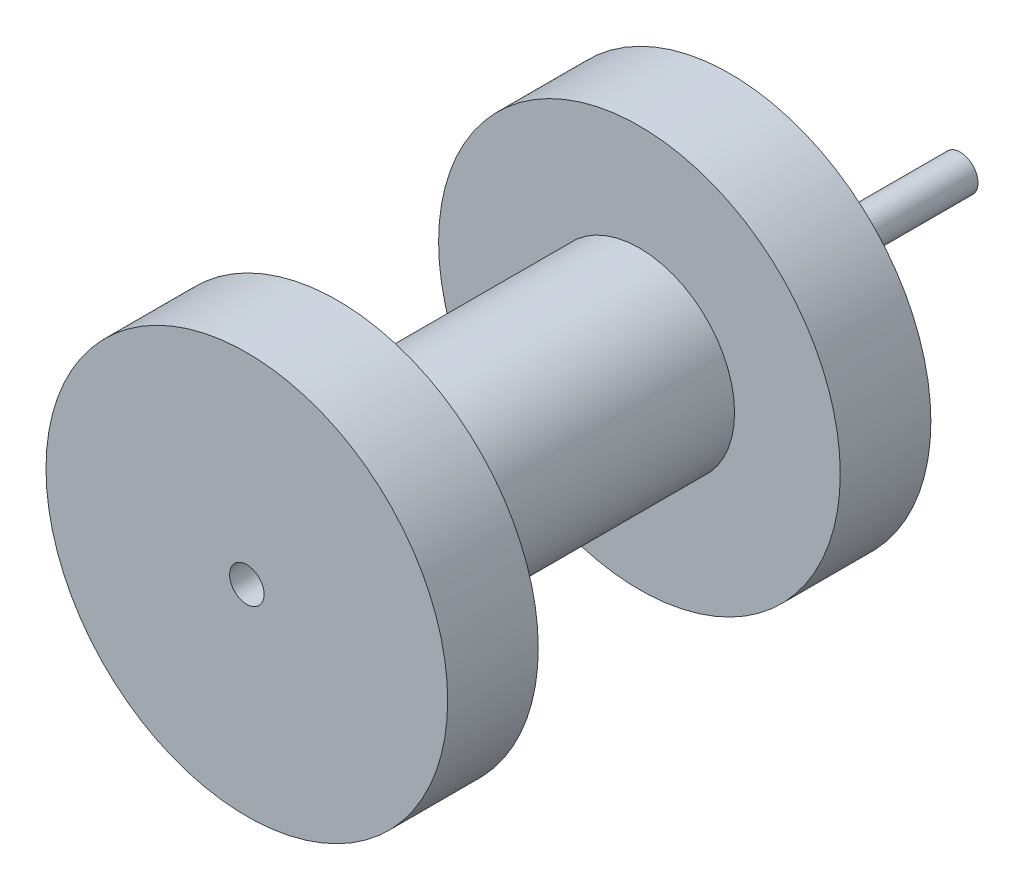
ISO-10303-21;
HEADER;
FILE_DESCRIPTION(('STEP AP214'),'2;1');
FILE_NAME('part.step','',(''),(''),'','','');
FILE_SCHEMA(('AUTOMOTIVE_DESIGN { 1 0 10303 214 1 1 1 1 }'));
ENDSEC;
DATA;
#1=APPLICATION_CONTEXT('core data for automotive mechanical design processes');
#2=APPLICATION_PROTOCOL_DEFINITION('international standard','automotive_design',2000,#1);
#3=PRODUCT_CONTEXT('',#1,'mechanical');
#4=PRODUCT('Part','Part','',(#3));
#5=PRODUCT_RELATED_PRODUCT_CATEGORY('part','',(#4));
#6=PRODUCT_DEFINITION_FORMATION('','',#4);
#7=PRODUCT_DEFINITION_CONTEXT('part definition',#1,'design');
#8=PRODUCT_DEFINITION('design','',#6,#7);
#9=PRODUCT_DEFINITION_SHAPE('','',#8);
#10=(LENGTH_UNIT() NAMED_UNIT(*) SI_UNIT(.MILLI.,.METRE.));
#11=(NAMED_UNIT(*) PLANE_ANGLE_UNIT() SI_UNIT($,.RADIAN.));
#12=(NAMED_UNIT(*) SI_UNIT($,.STERADIAN.) SOLID_ANGLE_UNIT());
#13=UNCERTAINTY_MEASURE_WITH_UNIT(LENGTH_MEASURE(1.E-05),#10,'distance_accuracy_value','');
#14=(GEOMETRIC_REPRESENTATION_CONTEXT(3) GLOBAL_UNCERTAINTY_ASSIGNED_CONTEXT((#13)) GLOBAL_UNIT_ASSIGNED_CONTEXT((#10,
#11,#12)) REPRESENTATION_CONTEXT('',''));
#15=CARTESIAN_POINT('',(0.,0.,0.));
#16=DIRECTION('',(0.,0.,1.));
#17=DIRECTION('',(1.,0.,0.));
#18=AXIS2_PLACEMENT_3D('',#15,#16,#17);
#19=CARTESIAN_POINT('',(0.,0.,29.9974));
#20=DIRECTION('',(0.,0.,-1.));
#21=DIRECTION('',(-1.,0.,0.));
#22=AXIS2_PLACEMENT_3D('',#19,#20,#21);
#23=CYLINDRICAL_SURFACE('',#22,1.500124);
#24=CARTESIAN_POINT('',(0.,0.,-10.6426));
#25=DIRECTION('',(0.,0.,-1.));
#26=DIRECTION('',(-1.,0.,0.));
#27=AXIS2_PLACEMENT_3D('',#24,#25,#26);
#28=CIRCLE('',#27,1.500124);
#29=CARTESIAN_POINT('',(-1.500124,0.,-10.6426));
#30=VERTEX_POINT('',#29);
#31=EDGE_CURVE('E87',#30,#30,#28,.T.);
#32=ORIENTED_EDGE('',*,*,#31,.T.);
#33=EDGE_LOOP('',(#32));
#34=FACE_BOUND('',#33,.T.);
#35=CARTESIAN_POINT('',(0.,0.,-29.9974));
#36=DIRECTION('',(0.,0.,1.));
#37=DIRECTION('',(1.,0.,0.));
#38=AXIS2_PLACEMENT_3D('',#35,#36,#37);
#39=CIRCLE('',#38,1.500124);
#40=CARTESIAN_POINT('',(1.500124,0.,-29.9974));
#41=VERTEX_POINT('',#40);
#42=EDGE_CURVE('E57',#41,#41,#39,.T.);
#43=ORIENTED_EDGE('',*,*,#42,.T.);
#44=EDGE_LOOP('',(#43));
#45=FACE_BOUND('',#44,.T.);
#46=ADVANCED_FACE('F42',(#34,#45),#23,.T.);
#47=CARTESIAN_POINT('',(0.,0.,29.9974));
#48=DIRECTION('',(0.,0.,1.));
#49=DIRECTION('',(1.,0.,0.));
#50=AXIS2_PLACEMENT_3D('',#47,#48,#49);
#51=PLANE('',#50);
#52=CARTESIAN_POINT('',(0.,0.,29.9974));
#53=DIRECTION('',(0.,0.,1.));
#54=DIRECTION('',(1.,0.,0.));
#55=AXIS2_PLACEMENT_3D('',#52,#53,#54);
#56=CIRCLE('',#55,16.891);
#57=CARTESIAN_POINT('',(16.891,0.,29.9974));
#58=VERTEX_POINT('',#57);
#59=EDGE_CURVE('E69',#58,#58,#56,.T.);
#60=ORIENTED_EDGE('',*,*,#59,.T.);
#61=EDGE_LOOP('',(#60));
#62=FACE_BOUND('',#61,.T.);
#63=CARTESIAN_POINT('',(0.,0.,29.9974));
#64=DIRECTION('',(0.,0.,1.));
#65=DIRECTION('',(1.,0.,0.));
#66=AXIS2_PLACEMENT_3D('',#63,#64,#65);
#67=CIRCLE('',#66,1.449324);
#68=CARTESIAN_POINT('',(1.449324,0.,29.9974));
#69=VERTEX_POINT('',#68);
#70=EDGE_CURVE('E62',#69,#69,#67,.T.);
#71=ORIENTED_EDGE('',*,*,#70,.F.);
#72=EDGE_LOOP('',(#71));
#73=FACE_BOUND('',#72,.T.);
#74=ADVANCED_FACE('F112',(#62,#73),#51,.T.);
#75=CARTESIAN_POINT('',(0.,0.,-29.9974));
#76=DIRECTION('',(0.,0.,1.));
#77=DIRECTION('',(1.,0.,0.));
#78=AXIS2_PLACEMENT_3D('',#75,#76,#77);
#79=PLANE('',#78);
#80=CARTESIAN_POINT('',(0.,0.,-29.9974));
#81=DIRECTION('',(0.,0.,1.));
#82=DIRECTION('',(1.,0.,0.));
#83=AXIS2_PLACEMENT_3D('',#80,#81,#82);
#84=CIRCLE('',#83,1.449324);
#85=CARTESIAN_POINT('',(1.449324,0.,-29.9974));
#86=VERTEX_POINT('',#85);
#87=EDGE_CURVE('E63',#86,#86,#84,.T.);
#88=ORIENTED_EDGE('',*,*,#87,.T.);
#89=EDGE_LOOP('',(#88));
#90=FACE_BOUND('',#89,.T.);
#91=ORIENTED_EDGE('',*,*,#42,.F.);
#92=EDGE_LOOP('',(#91));
#93=FACE_BOUND('',#92,.T.);
#94=ADVANCED_FACE('F118',(#90,#93),#79,.F.);
#95=CARTESIAN_POINT('',(0.,0.,29.9974));
#96=DIRECTION('',(0.,0.,-1.));
#97=DIRECTION('',(-1.,0.,0.));
#98=AXIS2_PLACEMENT_3D('',#95,#96,#97);
#99=CYLINDRICAL_SURFACE('',#98,1.449324);
#100=ORIENTED_EDGE('',*,*,#70,.T.);
#101=EDGE_LOOP('',(#100));
#102=FACE_BOUND('',#101,.T.);
#103=ORIENTED_EDGE('',*,*,#87,.F.);
#104=EDGE_LOOP('',(#103));
#105=FACE_BOUND('',#104,.T.);
#106=ADVANCED_FACE('F147',(#102,#105),#99,.F.);
#107=CARTESIAN_POINT('',(0.,0.,22.3774));
#108=DIRECTION('',(0.,0.,1.));
#109=DIRECTION('',(1.,0.,0.));
#110=AXIS2_PLACEMENT_3D('',#107,#108,#109);
#111=PLANE('',#110);
#112=CARTESIAN_POINT('',(0.,0.,22.3774));
#113=DIRECTION('',(0.,0.,1.));
#114=DIRECTION('',(1.,0.,0.));
#115=AXIS2_PLACEMENT_3D('',#112,#113,#114);
#116=CIRCLE('',#115,7.9999967);
#117=CARTESIAN_POINT('',(7.9999967,0.,22.3774));
#118=VERTEX_POINT('',#117);
#119=EDGE_CURVE('E49',#118,#118,#116,.F.);
#120=ORIENTED_EDGE('',*,*,#119,.F.);
#121=EDGE_LOOP('',(#120));
#122=FACE_BOUND('',#121,.T.);
#123=CARTESIAN_POINT('',(0.,0.,22.3774));
#124=DIRECTION('',(0.,0.,1.));
#125=DIRECTION('',(1.,0.,0.));
#126=AXIS2_PLACEMENT_3D('',#123,#124,#125);
#127=CIRCLE('',#126,16.891);
#128=CARTESIAN_POINT('',(16.891,0.,22.3774));
#129=VERTEX_POINT('',#128);
#130=EDGE_CURVE('E66',#129,#129,#127,.T.);
#131=ORIENTED_EDGE('',*,*,#130,.F.);
#132=EDGE_LOOP('',(#131));
#133=FACE_BOUND('',#132,.T.);
#134=ADVANCED_FACE('F132',(#122,#133),#111,.F.);
#135=CARTESIAN_POINT('',(0.,0.,22.3774));
#136=DIRECTION('',(0.,0.,1.));
#137=DIRECTION('',(1.,0.,0.));
#138=AXIS2_PLACEMENT_3D('',#135,#136,#137);
#139=CYLINDRICAL_SURFACE('',#138,16.891);
#140=CARTESIAN_POINT('',(16.891,0.,22.3774));
#141=CARTESIAN_POINT('',(16.891,0.,22.456775));
#142=CARTESIAN_POINT('',(16.891,0.,22.53615));
#143=CARTESIAN_POINT('',(16.891,0.,22.6949));
#144=CARTESIAN_POINT('',(16.891,0.,22.774275));
#145=CARTESIAN_POINT('',(16.891,0.,22.933025));
#146=CARTESIAN_POINT('',(16.891,0.,23.0124));
#147=CARTESIAN_POINT('',(16.891,0.,23.17115));
#148=CARTESIAN_POINT('',(16.891,0.,23.250525));
#149=CARTESIAN_POINT('',(16.891,0.,23.409275));
#150=CARTESIAN_POINT('',(16.891,0.,23.48865));
#151=CARTESIAN_POINT('',(16.891,0.,23.6474));
#152=CARTESIAN_POINT('',(16.891,0.,23.726775));
#153=CARTESIAN_POINT('',(16.891,0.,23.885525));
#154=CARTESIAN_POINT('',(16.891,0.,23.9649));
#155=CARTESIAN_POINT('',(16.891,0.,24.12365));
#156=CARTESIAN_POINT('',(16.891,0.,24.203025));
#157=CARTESIAN_POINT('',(16.891,0.,24.361775));
#158=CARTESIAN_POINT('',(16.891,0.,24.44115));
#159=CARTESIAN_POINT('',(16.891,0.,24.5999));
#160=CARTESIAN_POINT('',(16.891,0.,24.679275));
#161=CARTESIAN_POINT('',(16.891,0.,24.838025));
#162=CARTESIAN_POINT('',(16.891,0.,24.9174));
#163=CARTESIAN_POINT('',(16.891,0.,25.07615));
#164=CARTESIAN_POINT('',(16.891,0.,25.155525));
#165=CARTESIAN_POINT('',(16.891,0.,25.314275));
#166=CARTESIAN_POINT('',(16.891,0.,25.39365));
#167=CARTESIAN_POINT('',(16.891,0.,25.5524));
#168=CARTESIAN_POINT('',(16.891,0.,25.631775));
#169=CARTESIAN_POINT('',(16.891,0.,25.790525));
#170=CARTESIAN_POINT('',(16.891,0.,25.8699));
#171=CARTESIAN_POINT('',(16.891,0.,26.02865));
#172=CARTESIAN_POINT('',(16.891,0.,26.108025));
#173=CARTESIAN_POINT('',(16.891,0.,26.266775));
#174=CARTESIAN_POINT('',(16.891,0.,26.34615));
#175=CARTESIAN_POINT('',(16.891,0.,26.5049));
#176=CARTESIAN_POINT('',(16.891,0.,26.584275));
#177=CARTESIAN_POINT('',(16.891,0.,26.743025));
#178=CARTESIAN_POINT('',(16.891,0.,26.8224));
#179=CARTESIAN_POINT('',(16.891,0.,26.98115));
#180=CARTESIAN_POINT('',(16.891,0.,27.060525));
#181=CARTESIAN_POINT('',(16.891,0.,27.219275));
#182=CARTESIAN_POINT('',(16.891,0.,27.29865));
#183=CARTESIAN_POINT('',(16.891,0.,27.4574));
#184=CARTESIAN_POINT('',(16.891,0.,27.536775));
#185=CARTESIAN_POINT('',(16.891,0.,27.695525));
#186=CARTESIAN_POINT('',(16.891,0.,27.7749));
#187=CARTESIAN_POINT('',(16.891,0.,27.93365));
#188=CARTESIAN_POINT('',(16.891,0.,28.013025));
#189=CARTESIAN_POINT('',(16.891,0.,28.171775));
#190=CARTESIAN_POINT('',(16.891,0.,28.25115));
#191=CARTESIAN_POINT('',(16.891,0.,28.4099));
#192=CARTESIAN_POINT('',(16.891,0.,28.489275));
#193=CARTESIAN_POINT('',(16.891,0.,28.648025));
#194=CARTESIAN_POINT('',(16.891,0.,28.7274));
#195=CARTESIAN_POINT('',(16.891,0.,28.88615));
#196=CARTESIAN_POINT('',(16.891,0.,28.965525));
#197=CARTESIAN_POINT('',(16.891,0.,29.124275));
#198=CARTESIAN_POINT('',(16.891,0.,29.20365));
#199=CARTESIAN_POINT('',(16.891,0.,29.3624));
#200=CARTESIAN_POINT('',(16.891,0.,29.441775));
#201=CARTESIAN_POINT('',(16.891,0.,29.600525));
#202=CARTESIAN_POINT('',(16.891,0.,29.6799));
#203=CARTESIAN_POINT('',(16.891,0.,29.83865));
#204=CARTESIAN_POINT('',(16.891,0.,29.918025));
#205=CARTESIAN_POINT('',(16.891,0.,29.9974));
#206=B_SPLINE_CURVE_WITH_KNOTS('',3,(#140,#141,#142,#143,#144,#145,#146,#147,#148,#149,#150,
#151,#152,#153,#154,#155,#156,#157,#158,#159,#160,#161,#162,#163,#164,#165,#166,#167,#168,#169,
#170,#171,#172,#173,#174,#175,#176,#177,#178,#179,#180,#181,#182,#183,#184,#185,#186,#187,#188,
#189,#190,#191,#192,#193,#194,#195,#196,#197,#198,#199,#200,#201,#202,#203,#204,#205),
.UNSPECIFIED.,.F.,.F.,(4,2,2,2,2,2,2,2,2,2,2,2,2,2,2,2,2,2,2,2,2,2,2,2,2,2,2,2,2,2,2,2,4),(0.,
0.238125000000002,0.476250000000001,0.714375000000003,0.952500000000002,1.190625,1.42875,
1.666875,1.905,2.143125,2.38125,2.619375,2.8575,3.095625,3.33375,3.571875,3.81,4.048125,4.28625,
4.524375,4.7625,5.000625,5.23875,5.476875,5.715,5.953125,6.19125,6.429375,6.6675,6.905625,
7.14375,7.381875,7.62),.UNSPECIFIED.);
#207=EDGE_CURVE('BSEAM143',#129,#58,#206,.T.);
#208=ORIENTED_EDGE('',*,*,#130,.T.);
#209=ORIENTED_EDGE('',*,*,#59,.F.);
#210=ORIENTED_EDGE('',*,*,#207,.T.);
#211=ORIENTED_EDGE('',*,*,#207,.F.);
#212=EDGE_LOOP('',(#208,#210,#209,#211));
#213=FACE_BOUND('',#212,.T.);
#214=ADVANCED_FACE('F143',(#213),#139,.T.);
#215=CARTESIAN_POINT('',(0.,0.,-3.0226));
#216=DIRECTION('',(0.,0.,1.));
#217=DIRECTION('',(1.,0.,0.));
#218=AXIS2_PLACEMENT_3D('',#215,#216,#217);
#219=CYLINDRICAL_SURFACE('',#218,7.9999967);
#220=CARTESIAN_POINT('',(0.,0.,-3.0226));
#221=DIRECTION('',(0.,0.,-1.));
#222=DIRECTION('',(-1.,0.,0.));
#223=AXIS2_PLACEMENT_3D('',#220,#221,#222);
#224=CIRCLE('',#223,7.9999967);
#225=CARTESIAN_POINT('',(-7.9999967,0.,-3.0226));
#226=VERTEX_POINT('',#225);
#227=EDGE_CURVE('E72',#226,#226,#224,.T.);
#228=ORIENTED_EDGE('',*,*,#227,.F.);
#229=EDGE_LOOP('',(#228));
#230=FACE_BOUND('',#229,.T.);
#231=ORIENTED_EDGE('',*,*,#119,.T.);
#232=EDGE_LOOP('',(#231));
#233=FACE_BOUND('',#232,.T.);
#234=ADVANCED_FACE('F107',(#230,#233),#219,.T.);
#235=CARTESIAN_POINT('',(0.,0.,-3.0226));
#236=DIRECTION('',(0.,0.,-1.));
#237=DIRECTION('',(-1.,0.,0.));
#238=AXIS2_PLACEMENT_3D('',#235,#236,#237);
#239=PLANE('',#238);
#240=CARTESIAN_POINT('',(0.,0.,-3.0226));
#241=DIRECTION('',(0.,0.,-1.));
#242=DIRECTION('',(-1.,0.,0.));
#243=AXIS2_PLACEMENT_3D('',#240,#241,#242);
#244=CIRCLE('',#243,16.891);
#245=CARTESIAN_POINT('',(16.891,0.,-3.0226));
#246=VERTEX_POINT('',#245);
#247=EDGE_CURVE('E84',#246,#246,#244,.T.);
#248=ORIENTED_EDGE('',*,*,#247,.F.);
#249=EDGE_LOOP('',(#248));
#250=FACE_BOUND('',#249,.T.);
#251=ORIENTED_EDGE('',*,*,#227,.T.);
#252=EDGE_LOOP('',(#251));
#253=FACE_BOUND('',#252,.T.);
#254=ADVANCED_FACE('F98',(#250,#253),#239,.F.);
#255=CARTESIAN_POINT('',(0.,0.,-10.6426));
#256=DIRECTION('',(0.,0.,-1.));
#257=DIRECTION('',(-1.,0.,0.));
#258=AXIS2_PLACEMENT_3D('',#255,#256,#257);
#259=PLANE('',#258);
#260=CARTESIAN_POINT('',(0.,0.,-10.6426));
#261=DIRECTION('',(0.,0.,-1.));
#262=DIRECTION('',(-1.,0.,0.));
#263=AXIS2_PLACEMENT_3D('',#260,#261,#262);
#264=CIRCLE('',#263,16.891);
#265=CARTESIAN_POINT('',(16.891,0.,-10.6426));
#266=VERTEX_POINT('',#265);
#267=EDGE_CURVE('E83',#266,#266,#264,.T.);
#268=ORIENTED_EDGE('',*,*,#267,.T.);
#269=EDGE_LOOP('',(#268));
#270=FACE_BOUND('',#269,.T.);
#271=ORIENTED_EDGE('',*,*,#31,.F.);
#272=EDGE_LOOP('',(#271));
#273=FACE_BOUND('',#272,.T.);
#274=ADVANCED_FACE('F95',(#270,#273),#259,.T.);
#275=CARTESIAN_POINT('',(0.,0.,-10.6426));
#276=DIRECTION('',(0.,0.,1.));
#277=DIRECTION('',(1.,0.,0.));
#278=AXIS2_PLACEMENT_3D('',#275,#276,#277);
#279=CYLINDRICAL_SURFACE('',#278,16.891);
#280=CARTESIAN_POINT('',(16.891,0.,-10.6426));
#281=CARTESIAN_POINT('',(16.891,0.,-10.563225));
#282=CARTESIAN_POINT('',(16.891,0.,-10.48385));
#283=CARTESIAN_POINT('',(16.891,0.,-10.3251));
#284=CARTESIAN_POINT('',(16.891,0.,-10.245725));
#285=CARTESIAN_POINT('',(16.891,0.,-10.086975));
#286=CARTESIAN_POINT('',(16.891,0.,-10.0076));
#287=CARTESIAN_POINT('',(16.891,0.,-9.84884999999999));
#288=CARTESIAN_POINT('',(16.891,0.,-9.76947499999999));
#289=CARTESIAN_POINT('',(16.891,0.,-9.610725));
#290=CARTESIAN_POINT('',(16.891,0.,-9.53134999999999));
#291=CARTESIAN_POINT('',(16.891,0.,-9.37259999999999));
#292=CARTESIAN_POINT('',(16.891,0.,-9.29322499999999));
#293=CARTESIAN_POINT('',(16.891,0.,-9.13447499999999));
#294=CARTESIAN_POINT('',(16.891,0.,-9.05509999999999));
#295=CARTESIAN_POINT('',(16.891,0.,-8.89635));
#296=CARTESIAN_POINT('',(16.891,0.,-8.81697499999999));
#297=CARTESIAN_POINT('',(16.891,0.,-8.65822499999999));
#298=CARTESIAN_POINT('',(16.891,0.,-8.57885));
#299=CARTESIAN_POINT('',(16.891,0.,-8.4201));
#300=CARTESIAN_POINT('',(16.891,0.,-8.340725));
#301=CARTESIAN_POINT('',(16.891,0.,-8.181975));
#302=CARTESIAN_POINT('',(16.891,0.,-8.1026));
#303=CARTESIAN_POINT('',(16.891,0.,-7.94384999999999));
#304=CARTESIAN_POINT('',(16.891,0.,-7.86447499999999));
#305=CARTESIAN_POINT('',(16.891,0.,-7.70572499999999));
#306=CARTESIAN_POINT('',(16.891,0.,-7.62634999999999));
#307=CARTESIAN_POINT('',(16.891,0.,-7.4676));
#308=CARTESIAN_POINT('',(16.891,0.,-7.38822499999999));
#309=CARTESIAN_POINT('',(16.891,0.,-7.22947499999999));
#310=CARTESIAN_POINT('',(16.891,0.,-7.15009999999999));
#311=CARTESIAN_POINT('',(16.891,0.,-6.99135));
#312=CARTESIAN_POINT('',(16.891,0.,-6.91197499999999));
#313=CARTESIAN_POINT('',(16.891,0.,-6.753225));
#314=CARTESIAN_POINT('',(16.891,0.,-6.67385));
#315=CARTESIAN_POINT('',(16.891,0.,-6.5151));
#316=CARTESIAN_POINT('',(16.891,0.,-6.435725));
#317=CARTESIAN_POINT('',(16.891,0.,-6.276975));
#318=CARTESIAN_POINT('',(16.891,0.,-6.1976));
#319=CARTESIAN_POINT('',(16.891,0.,-6.03885));
#320=CARTESIAN_POINT('',(16.891,0.,-5.95947499999999));
#321=CARTESIAN_POINT('',(16.891,0.,-5.800725));
#322=CARTESIAN_POINT('',(16.891,0.,-5.72135));
#323=CARTESIAN_POINT('',(16.891,0.,-5.5626));
#324=CARTESIAN_POINT('',(16.891,0.,-5.483225));
#325=CARTESIAN_POINT('',(16.891,0.,-5.324475));
#326=CARTESIAN_POINT('',(16.891,0.,-5.2451));
#327=CARTESIAN_POINT('',(16.891,0.,-5.08635));
#328=CARTESIAN_POINT('',(16.891,0.,-5.006975));
#329=CARTESIAN_POINT('',(16.891,0.,-4.848225));
#330=CARTESIAN_POINT('',(16.891,0.,-4.76885));
#331=CARTESIAN_POINT('',(16.891,0.,-4.6101));
#332=CARTESIAN_POINT('',(16.891,0.,-4.530725));
#333=CARTESIAN_POINT('',(16.891,0.,-4.371975));
#334=CARTESIAN_POINT('',(16.891,0.,-4.2926));
#335=CARTESIAN_POINT('',(16.891,0.,-4.13385));
#336=CARTESIAN_POINT('',(16.891,0.,-4.054475));
#337=CARTESIAN_POINT('',(16.891,0.,-3.895725));
#338=CARTESIAN_POINT('',(16.891,0.,-3.81635));
#339=CARTESIAN_POINT('',(16.891,0.,-3.6576));
#340=CARTESIAN_POINT('',(16.891,0.,-3.578225));
#341=CARTESIAN_POINT('',(16.891,0.,-3.419475));
#342=CARTESIAN_POINT('',(16.891,0.,-3.3401));
#343=CARTESIAN_POINT('',(16.891,0.,-3.18135));
#344=CARTESIAN_POINT('',(16.891,0.,-3.101975));
#345=CARTESIAN_POINT('',(16.891,0.,-3.0226));
#346=B_SPLINE_CURVE_WITH_KNOTS('',3,(#280,#281,#282,#283,#284,#285,#286,#287,#288,#289,#290,
#291,#292,#293,#294,#295,#296,#297,#298,#299,#300,#301,#302,#303,#304,#305,#306,#307,#308,#309,
#310,#311,#312,#313,#314,#315,#316,#317,#318,#319,#320,#321,#322,#323,#324,#325,#326,#327,#328,
#329,#330,#331,#332,#333,#334,#335,#336,#337,#338,#339,#340,#341,#342,#343,#344,#345),
.UNSPECIFIED.,.F.,.F.,(4,2,2,2,2,2,2,2,2,2,2,2,2,2,2,2,2,2,2,2,2,2,2,2,2,2,2,2,2,2,2,2,4),(0.,
0.238125,0.476250000000001,0.714375000000001,0.9525,1.190625,1.42875,1.666875,1.905,2.143125,
2.38125,2.619375,2.8575,3.095625,3.33375,3.571875,3.81,4.048125,4.28625,4.524375,4.7625,
5.000625,5.23875,5.476875,5.715,5.953125,6.19125,6.429375,6.6675,6.905625,7.14375,7.381875,
7.62),.UNSPECIFIED.);
#347=EDGE_CURVE('BSEAM97',#266,#246,#346,.T.);
#348=ORIENTED_EDGE('',*,*,#267,.F.);
#349=ORIENTED_EDGE('',*,*,#247,.T.);
#350=ORIENTED_EDGE('',*,*,#347,.T.);
#351=ORIENTED_EDGE('',*,*,#347,.F.);
#352=EDGE_LOOP('',(#348,#350,#349,#351));
#353=FACE_BOUND('',#352,.T.);
#354=ADVANCED_FACE('F97',(#353),#279,.T.);
#355=CLOSED_SHELL('',(#46,#74,#94,#106,#134,#214,#234,#254,#274,#354));
#356=CARTESIAN_POINT('',(0.,0.,-3.0226));
#357=DIRECTION('',(0.,0.,-1.));
#358=DIRECTION('',(-1.,0.,0.));
#359=AXIS2_PLACEMENT_3D('',#356,#357,#358);
#360=CIRCLE('',#359,7.62);
#361=CARTESIAN_POINT('',(-7.62,0.,-3.0226));
#362=VERTEX_POINT('',#361);
#363=EDGE_CURVE('E80',#362,#362,#360,.T.);
#364=ORIENTED_EDGE('',*,*,#363,.F.);
#365=EDGE_LOOP('',(#364));
#366=FACE_BOUND('',#365,.T.);
#367=CARTESIAN_POINT('',(0.,0.,-3.02259999999999));
#368=DIRECTION('',(0.,0.,-1.));
#369=DIRECTION('',(-1.,0.,0.));
#370=AXIS2_PLACEMENT_3D('',#367,#368,#369);
#371=CIRCLE('',#370,1.500124);
#372=CARTESIAN_POINT('',(-1.500124,0.,-3.02259999999999));
#373=VERTEX_POINT('',#372);
#374=EDGE_CURVE('E10',#373,#373,#371,.T.);
#375=ORIENTED_EDGE('',*,*,#374,.T.);
#376=EDGE_LOOP('',(#375));
#377=FACE_BOUND('',#376,.T.);
#378=ADVANCED_FACE('F110',(#366,#377),#239,.F.);
#379=CARTESIAN_POINT('',(0.,0.,-3.0226));
#380=DIRECTION('',(0.,0.,1.));
#381=DIRECTION('',(1.,0.,0.));
#382=AXIS2_PLACEMENT_3D('',#379,#380,#381);
#383=CYLINDRICAL_SURFACE('',#382,7.62);
#384=ORIENTED_EDGE('',*,*,#363,.T.);
#385=EDGE_LOOP('',(#384));
#386=FACE_BOUND('',#385,.T.);
#387=CARTESIAN_POINT('',(0.,0.,22.3774));
#388=DIRECTION('',(0.,0.,-1.));
#389=DIRECTION('',(-1.,0.,0.));
#390=AXIS2_PLACEMENT_3D('',#387,#388,#389);
#391=CIRCLE('',#390,7.62);
#392=CARTESIAN_POINT('',(-7.62,0.,22.3774));
#393=VERTEX_POINT('',#392);
#394=EDGE_CURVE('E77',#393,#393,#391,.T.);
#395=ORIENTED_EDGE('',*,*,#394,.F.);
#396=EDGE_LOOP('',(#395));
#397=FACE_BOUND('',#396,.T.);
#398=ADVANCED_FACE('F129',(#386,#397),#383,.F.);
#399=CARTESIAN_POINT('',(0.,0.,22.3774));
#400=DIRECTION('',(0.,0.,1.));
#401=DIRECTION('',(1.,0.,0.));
#402=AXIS2_PLACEMENT_3D('',#399,#400,#401);
#403=CIRCLE('',#402,1.500124);
#404=CARTESIAN_POINT('',(1.500124,0.,22.3774));
#405=VERTEX_POINT('',#404);
#406=EDGE_CURVE('E53',#405,#405,#403,.T.);
#407=ORIENTED_EDGE('',*,*,#406,.T.);
#408=EDGE_LOOP('',(#407));
#409=FACE_BOUND('',#408,.T.);
#410=ORIENTED_EDGE('',*,*,#394,.T.);
#411=EDGE_LOOP('',(#410));
#412=FACE_BOUND('',#411,.T.);
#413=ADVANCED_FACE('F122',(#409,#412),#111,.F.);
#414=ORIENTED_EDGE('',*,*,#406,.F.);
#415=EDGE_LOOP('',(#414));
#416=FACE_BOUND('',#415,.T.);
#417=ORIENTED_EDGE('',*,*,#374,.F.);
#418=EDGE_LOOP('',(#417));
#419=FACE_BOUND('',#418,.T.);
#420=ADVANCED_FACE('F113',(#416,#419),#23,.T.);
#421=CLOSED_SHELL('',(#378,#398,#413,#420));
#422=ORIENTED_CLOSED_SHELL('',*,#421,.T.);
#423=BREP_WITH_VOIDS('B2',#355,(#422));
#424=ADVANCED_BREP_SHAPE_REPRESENTATION('',(#18,#423),#14);
#425=SHAPE_DEFINITION_REPRESENTATION(#9,#424);
ENDSEC;
END-ISO-10303-21;
